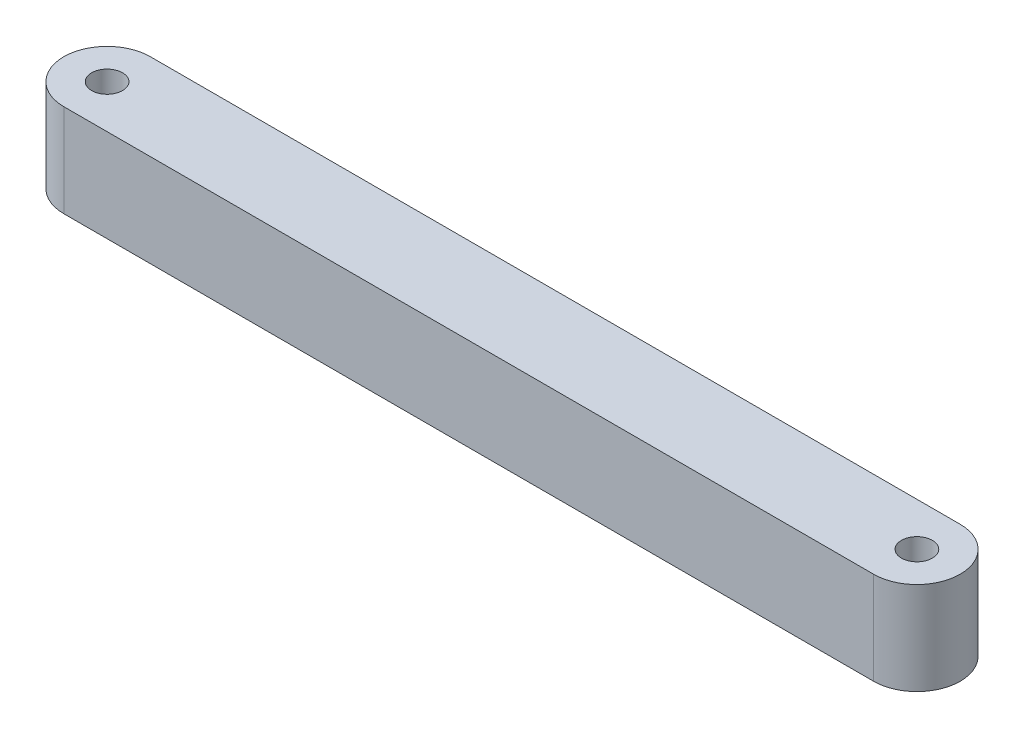
ISO-10303-21;
HEADER;
FILE_DESCRIPTION(('STEP AP214'),'2;1');
FILE_NAME('part.step','',(''),(''),'','','');
FILE_SCHEMA(('AUTOMOTIVE_DESIGN { 1 0 10303 214 1 1 1 1 }'));
ENDSEC;
DATA;
#1=APPLICATION_CONTEXT('core data for automotive mechanical design processes');
#2=APPLICATION_PROTOCOL_DEFINITION('international standard','automotive_design',2000,#1);
#3=PRODUCT_CONTEXT('',#1,'mechanical');
#4=PRODUCT('Part','Part','',(#3));
#5=PRODUCT_RELATED_PRODUCT_CATEGORY('part','',(#4));
#6=PRODUCT_DEFINITION_FORMATION('','',#4);
#7=PRODUCT_DEFINITION_CONTEXT('part definition',#1,'design');
#8=PRODUCT_DEFINITION('design','',#6,#7);
#9=PRODUCT_DEFINITION_SHAPE('','',#8);
#10=(LENGTH_UNIT() NAMED_UNIT(*) SI_UNIT(.MILLI.,.METRE.));
#11=(NAMED_UNIT(*) PLANE_ANGLE_UNIT() SI_UNIT($,.RADIAN.));
#12=(NAMED_UNIT(*) SI_UNIT($,.STERADIAN.) SOLID_ANGLE_UNIT());
#13=UNCERTAINTY_MEASURE_WITH_UNIT(LENGTH_MEASURE(1.E-05),#10,'distance_accuracy_value','');
#14=(GEOMETRIC_REPRESENTATION_CONTEXT(3) GLOBAL_UNCERTAINTY_ASSIGNED_CONTEXT((#13)) GLOBAL_UNIT_ASSIGNED_CONTEXT((#10,
#11,#12)) REPRESENTATION_CONTEXT('',''));
#15=CARTESIAN_POINT('',(0.,0.,0.));
#16=DIRECTION('',(0.,0.,1.));
#17=DIRECTION('',(1.,0.,0.));
#18=AXIS2_PLACEMENT_3D('',#15,#16,#17);
#19=CARTESIAN_POINT('',(0.,15.,-7.));
#20=DIRECTION('',(0.,0.,-1.));
#21=DIRECTION('',(-1.,0.,0.));
#22=AXIS2_PLACEMENT_3D('',#19,#20,#21);
#23=PLANE('',#22);
#24=DIRECTION('',(1.,0.,0.));
#25=VECTOR('',#24,1.);
#26=CARTESIAN_POINT('',(0.,0.,-7.));
#27=LINE('',#26,#25);
#28=CARTESIAN_POINT('',(-131.,0.,-7.));
#29=VERTEX_POINT('',#28);
#30=CARTESIAN_POINT('',(0.,0.,-7.));
#31=VERTEX_POINT('',#30);
#32=EDGE_CURVE('E115',#29,#31,#27,.T.);
#33=ORIENTED_EDGE('',*,*,#32,.F.);
#34=DIRECTION('',(0.,-1.,0.));
#35=VECTOR('',#34,1.);
#36=CARTESIAN_POINT('',(-131.,15.,-7.));
#37=LINE('',#36,#35);
#38=CARTESIAN_POINT('',(-131.,15.,-7.));
#39=VERTEX_POINT('',#38);
#40=EDGE_CURVE('E11',#39,#29,#37,.T.);
#41=ORIENTED_EDGE('',*,*,#40,.F.);
#42=DIRECTION('',(1.,0.,0.));
#43=VECTOR('',#42,1.);
#44=CARTESIAN_POINT('',(0.,15.,-7.));
#45=LINE('',#44,#43);
#46=CARTESIAN_POINT('',(0.,15.,-7.));
#47=VERTEX_POINT('',#46);
#48=EDGE_CURVE('E94',#39,#47,#45,.T.);
#49=ORIENTED_EDGE('',*,*,#48,.T.);
#50=DIRECTION('',(0.,-1.,0.));
#51=VECTOR('',#50,1.);
#52=CARTESIAN_POINT('',(0.,15.,-7.));
#53=LINE('',#52,#51);
#54=EDGE_CURVE('E83',#47,#31,#53,.T.);
#55=ORIENTED_EDGE('',*,*,#54,.T.);
#56=EDGE_LOOP('',(#33,#41,#49,#55));
#57=FACE_BOUND('',#56,.T.);
#58=ADVANCED_FACE('F45',(#57),#23,.T.);
#59=CARTESIAN_POINT('',(-131.,15.,0.));
#60=DIRECTION('',(0.,-1.,0.));
#61=DIRECTION('',(0.,0.,-1.));
#62=AXIS2_PLACEMENT_3D('',#59,#60,#61);
#63=CYLINDRICAL_SURFACE('',#62,7.);
#64=CARTESIAN_POINT('',(-131.,0.,0.));
#65=DIRECTION('',(0.,1.,0.));
#66=DIRECTION('',(0.,0.,1.));
#67=AXIS2_PLACEMENT_3D('',#64,#65,#66);
#68=CIRCLE('',#67,7.);
#69=CARTESIAN_POINT('',(-131.,0.,7.));
#70=VERTEX_POINT('',#69);
#71=EDGE_CURVE('E100',#29,#70,#68,.T.);
#72=ORIENTED_EDGE('',*,*,#71,.T.);
#73=DIRECTION('',(0.,-1.,0.));
#74=VECTOR('',#73,1.);
#75=CARTESIAN_POINT('',(-131.,15.,7.));
#76=LINE('',#75,#74);
#77=CARTESIAN_POINT('',(-131.,15.,7.));
#78=VERTEX_POINT('',#77);
#79=EDGE_CURVE('E53',#78,#70,#76,.T.);
#80=ORIENTED_EDGE('',*,*,#79,.F.);
#81=CARTESIAN_POINT('',(-131.,15.,0.));
#82=DIRECTION('',(0.,1.,0.));
#83=DIRECTION('',(0.,0.,1.));
#84=AXIS2_PLACEMENT_3D('',#81,#82,#83);
#85=CIRCLE('',#84,7.);
#86=EDGE_CURVE('E88',#39,#78,#85,.T.);
#87=ORIENTED_EDGE('',*,*,#86,.F.);
#88=ORIENTED_EDGE('',*,*,#40,.T.);
#89=EDGE_LOOP('',(#72,#80,#87,#88));
#90=FACE_BOUND('',#89,.T.);
#91=ADVANCED_FACE('F98',(#90),#63,.T.);
#92=CARTESIAN_POINT('',(0.,15.,7.));
#93=DIRECTION('',(0.,0.,1.));
#94=DIRECTION('',(1.,0.,0.));
#95=AXIS2_PLACEMENT_3D('',#92,#93,#94);
#96=PLANE('',#95);
#97=DIRECTION('',(-1.,0.,0.));
#98=VECTOR('',#97,1.);
#99=CARTESIAN_POINT('',(0.,0.,7.));
#100=LINE('',#99,#98);
#101=CARTESIAN_POINT('',(0.,0.,7.));
#102=VERTEX_POINT('',#101);
#103=EDGE_CURVE('E119',#102,#70,#100,.T.);
#104=ORIENTED_EDGE('',*,*,#103,.F.);
#105=DIRECTION('',(0.,-1.,0.));
#106=VECTOR('',#105,1.);
#107=CARTESIAN_POINT('',(0.,15.,7.));
#108=LINE('',#107,#106);
#109=CARTESIAN_POINT('',(0.,15.,7.));
#110=VERTEX_POINT('',#109);
#111=EDGE_CURVE('E76',#110,#102,#108,.T.);
#112=ORIENTED_EDGE('',*,*,#111,.F.);
#113=DIRECTION('',(-1.,0.,0.));
#114=VECTOR('',#113,1.);
#115=CARTESIAN_POINT('',(0.,15.,7.));
#116=LINE('',#115,#114);
#117=EDGE_CURVE('E93',#110,#78,#116,.T.);
#118=ORIENTED_EDGE('',*,*,#117,.T.);
#119=ORIENTED_EDGE('',*,*,#79,.T.);
#120=EDGE_LOOP('',(#104,#112,#118,#119));
#121=FACE_BOUND('',#120,.T.);
#122=ADVANCED_FACE('F104',(#121),#96,.T.);
#123=CARTESIAN_POINT('',(0.,15.,0.));
#124=DIRECTION('',(0.,-1.,0.));
#125=DIRECTION('',(0.,0.,-1.));
#126=AXIS2_PLACEMENT_3D('',#123,#124,#125);
#127=CYLINDRICAL_SURFACE('',#126,2.5);
#128=CARTESIAN_POINT('',(0.,15.,0.));
#129=DIRECTION('',(0.,1.,0.));
#130=DIRECTION('',(0.,0.,1.));
#131=AXIS2_PLACEMENT_3D('',#128,#129,#130);
#132=CIRCLE('',#131,2.5);
#133=CARTESIAN_POINT('',(0.,15.,2.5));
#134=VERTEX_POINT('',#133);
#135=EDGE_CURVE('E106',#134,#134,#132,.T.);
#136=ORIENTED_EDGE('',*,*,#135,.T.);
#137=EDGE_LOOP('',(#136));
#138=FACE_BOUND('',#137,.T.);
#139=CARTESIAN_POINT('',(0.,0.,0.));
#140=DIRECTION('',(0.,1.,0.));
#141=DIRECTION('',(0.,0.,1.));
#142=AXIS2_PLACEMENT_3D('',#139,#140,#141);
#143=CIRCLE('',#142,2.5);
#144=CARTESIAN_POINT('',(0.,0.,2.5));
#145=VERTEX_POINT('',#144);
#146=EDGE_CURVE('E123',#145,#145,#143,.T.);
#147=ORIENTED_EDGE('',*,*,#146,.F.);
#148=EDGE_LOOP('',(#147));
#149=FACE_BOUND('',#148,.T.);
#150=ADVANCED_FACE('F139',(#138,#149),#127,.F.);
#151=CARTESIAN_POINT('',(0.,15.,0.));
#152=DIRECTION('',(0.,-1.,0.));
#153=DIRECTION('',(0.,0.,-1.));
#154=AXIS2_PLACEMENT_3D('',#151,#152,#153);
#155=CYLINDRICAL_SURFACE('',#154,7.);
#156=CARTESIAN_POINT('',(0.,0.,0.));
#157=DIRECTION('',(0.,1.,0.));
#158=DIRECTION('',(0.,0.,1.));
#159=AXIS2_PLACEMENT_3D('',#156,#157,#158);
#160=CIRCLE('',#159,7.);
#161=EDGE_CURVE('E121',#102,#31,#160,.T.);
#162=ORIENTED_EDGE('',*,*,#161,.T.);
#163=ORIENTED_EDGE('',*,*,#54,.F.);
#164=CARTESIAN_POINT('',(0.,15.,0.));
#165=DIRECTION('',(0.,1.,0.));
#166=DIRECTION('',(0.,0.,1.));
#167=AXIS2_PLACEMENT_3D('',#164,#165,#166);
#168=CIRCLE('',#167,7.);
#169=EDGE_CURVE('E61',#110,#47,#168,.T.);
#170=ORIENTED_EDGE('',*,*,#169,.F.);
#171=ORIENTED_EDGE('',*,*,#111,.T.);
#172=EDGE_LOOP('',(#162,#163,#170,#171));
#173=FACE_BOUND('',#172,.T.);
#174=ADVANCED_FACE('F142',(#173),#155,.T.);
#175=CARTESIAN_POINT('',(-131.,15.,0.));
#176=DIRECTION('',(0.,-1.,0.));
#177=DIRECTION('',(0.,0.,-1.));
#178=AXIS2_PLACEMENT_3D('',#175,#176,#177);
#179=CYLINDRICAL_SURFACE('',#178,2.5);
#180=CARTESIAN_POINT('',(-131.,15.,0.));
#181=DIRECTION('',(0.,1.,0.));
#182=DIRECTION('',(0.,0.,1.));
#183=AXIS2_PLACEMENT_3D('',#180,#181,#182);
#184=CIRCLE('',#183,2.5);
#185=CARTESIAN_POINT('',(-131.,15.,2.5));
#186=VERTEX_POINT('',#185);
#187=EDGE_CURVE('E112',#186,#186,#184,.T.);
#188=ORIENTED_EDGE('',*,*,#187,.T.);
#189=EDGE_LOOP('',(#188));
#190=FACE_BOUND('',#189,.T.);
#191=CARTESIAN_POINT('',(-131.,0.,0.));
#192=DIRECTION('',(0.,1.,0.));
#193=DIRECTION('',(0.,0.,1.));
#194=AXIS2_PLACEMENT_3D('',#191,#192,#193);
#195=CIRCLE('',#194,2.5);
#196=CARTESIAN_POINT('',(-131.,0.,2.5));
#197=VERTEX_POINT('',#196);
#198=EDGE_CURVE('E126',#197,#197,#195,.T.);
#199=ORIENTED_EDGE('',*,*,#198,.F.);
#200=EDGE_LOOP('',(#199));
#201=FACE_BOUND('',#200,.T.);
#202=ADVANCED_FACE('F145',(#190,#201),#179,.F.);
#203=CARTESIAN_POINT('',(0.,15.,0.));
#204=DIRECTION('',(0.,1.,0.));
#205=DIRECTION('',(0.,0.,1.));
#206=AXIS2_PLACEMENT_3D('',#203,#204,#205);
#207=PLANE('',#206);
#208=ORIENTED_EDGE('',*,*,#48,.F.);
#209=ORIENTED_EDGE('',*,*,#86,.T.);
#210=ORIENTED_EDGE('',*,*,#117,.F.);
#211=ORIENTED_EDGE('',*,*,#169,.T.);
#212=EDGE_LOOP('',(#208,#209,#210,#211));
#213=FACE_BOUND('',#212,.T.);
#214=ORIENTED_EDGE('',*,*,#135,.F.);
#215=EDGE_LOOP('',(#214));
#216=FACE_BOUND('',#215,.T.);
#217=ORIENTED_EDGE('',*,*,#187,.F.);
#218=EDGE_LOOP('',(#217));
#219=FACE_BOUND('',#218,.T.);
#220=ADVANCED_FACE('F90',(#213,#216,#219),#207,.T.);
#221=CARTESIAN_POINT('',(0.,0.,0.));
#222=DIRECTION('',(0.,1.,0.));
#223=DIRECTION('',(0.,0.,1.));
#224=AXIS2_PLACEMENT_3D('',#221,#222,#223);
#225=PLANE('',#224);
#226=ORIENTED_EDGE('',*,*,#32,.T.);
#227=ORIENTED_EDGE('',*,*,#161,.F.);
#228=ORIENTED_EDGE('',*,*,#103,.T.);
#229=ORIENTED_EDGE('',*,*,#71,.F.);
#230=EDGE_LOOP('',(#226,#227,#228,#229));
#231=FACE_BOUND('',#230,.T.);
#232=ORIENTED_EDGE('',*,*,#146,.T.);
#233=EDGE_LOOP('',(#232));
#234=FACE_BOUND('',#233,.T.);
#235=ORIENTED_EDGE('',*,*,#198,.T.);
#236=EDGE_LOOP('',(#235));
#237=FACE_BOUND('',#236,.T.);
#238=ADVANCED_FACE('F152',(#231,#234,#237),#225,.F.);
#239=CLOSED_SHELL('',(#58,#91,#122,#150,#174,#202,#220,#238));
#240=MANIFOLD_SOLID_BREP('B2',#239);
#241=ADVANCED_BREP_SHAPE_REPRESENTATION('',(#18,#240),#14);
#242=SHAPE_DEFINITION_REPRESENTATION(#9,#241);
ENDSEC;
END-ISO-10303-21;
